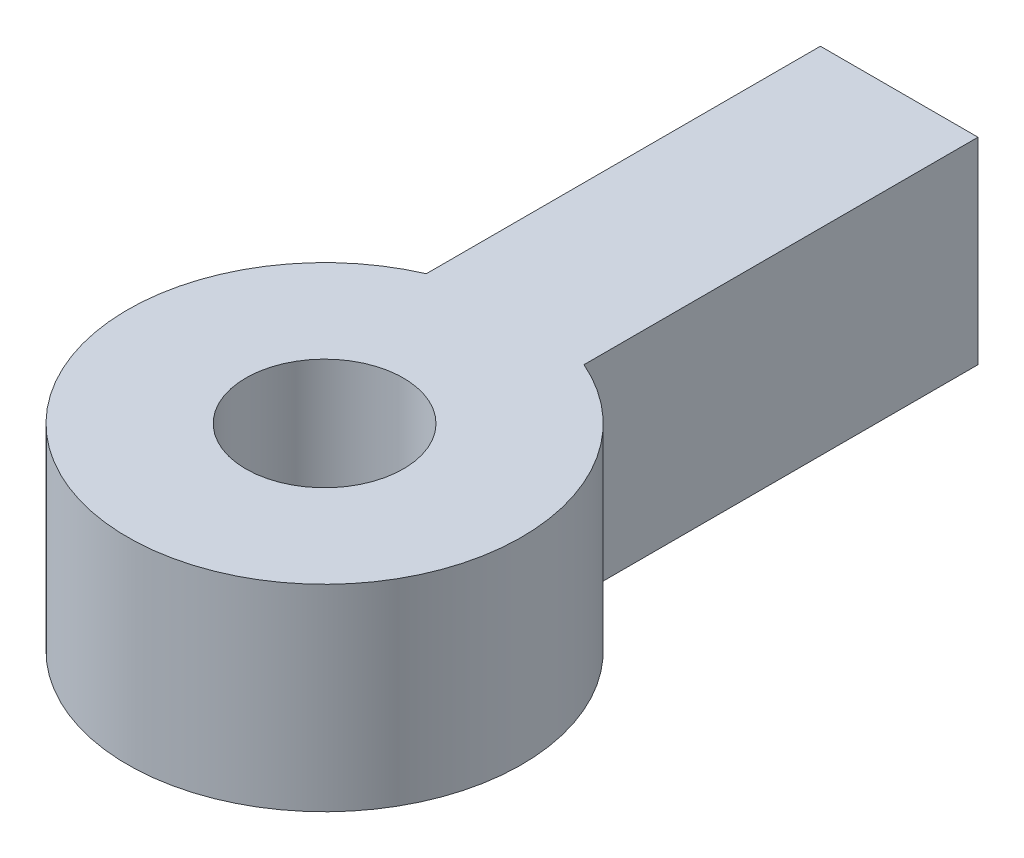
ISO-10303-21;
HEADER;
FILE_DESCRIPTION(('STEP AP214'),'2;1');
FILE_NAME('part.step','',(''),(''),'','','');
FILE_SCHEMA(('AUTOMOTIVE_DESIGN { 1 0 10303 214 1 1 1 1 }'));
ENDSEC;
DATA;
#1=APPLICATION_CONTEXT('core data for automotive mechanical design processes');
#2=APPLICATION_PROTOCOL_DEFINITION('international standard','automotive_design',2000,#1);
#3=PRODUCT_CONTEXT('',#1,'mechanical');
#4=PRODUCT('Part','Part','',(#3));
#5=PRODUCT_RELATED_PRODUCT_CATEGORY('part','',(#4));
#6=PRODUCT_DEFINITION_FORMATION('','',#4);
#7=PRODUCT_DEFINITION_CONTEXT('part definition',#1,'design');
#8=PRODUCT_DEFINITION('design','',#6,#7);
#9=PRODUCT_DEFINITION_SHAPE('','',#8);
#10=(LENGTH_UNIT() NAMED_UNIT(*) SI_UNIT(.MILLI.,.METRE.));
#11=(NAMED_UNIT(*) PLANE_ANGLE_UNIT() SI_UNIT($,.RADIAN.));
#12=(NAMED_UNIT(*) SI_UNIT($,.STERADIAN.) SOLID_ANGLE_UNIT());
#13=UNCERTAINTY_MEASURE_WITH_UNIT(LENGTH_MEASURE(1.E-05),#10,'distance_accuracy_value','');
#14=(GEOMETRIC_REPRESENTATION_CONTEXT(3) GLOBAL_UNCERTAINTY_ASSIGNED_CONTEXT((#13)) GLOBAL_UNIT_ASSIGNED_CONTEXT((#10,
#11,#12)) REPRESENTATION_CONTEXT('',''));
#15=CARTESIAN_POINT('',(0.,0.,0.));
#16=DIRECTION('',(0.,0.,1.));
#17=DIRECTION('',(1.,0.,0.));
#18=AXIS2_PLACEMENT_3D('',#15,#16,#17);
#19=CARTESIAN_POINT('',(0.,5.,0.));
#20=DIRECTION('',(0.,1.,0.));
#21=DIRECTION('',(0.,0.,1.));
#22=AXIS2_PLACEMENT_3D('',#19,#20,#21);
#23=PLANE('',#22);
#24=DIRECTION('',(0.,0.,1.));
#25=VECTOR('',#24,1.);
#26=CARTESIAN_POINT('',(-2.,5.,-14.5825756949558));
#27=LINE('',#26,#25);
#28=CARTESIAN_POINT('',(-2.,5.,-14.5825756949558));
#29=VERTEX_POINT('',#28);
#30=CARTESIAN_POINT('',(-2.,5.,-4.58257569495584));
#31=VERTEX_POINT('',#30);
#32=EDGE_CURVE('E85',#29,#31,#27,.T.);
#33=ORIENTED_EDGE('',*,*,#32,.T.);
#34=CARTESIAN_POINT('',(0.,5.,0.));
#35=DIRECTION('',(0.,1.,0.));
#36=DIRECTION('',(0.,0.,1.));
#37=AXIS2_PLACEMENT_3D('',#34,#35,#36);
#38=CIRCLE('',#37,5.);
#39=CARTESIAN_POINT('',(2.,5.,-4.58257569495584));
#40=VERTEX_POINT('',#39);
#41=EDGE_CURVE('E80',#31,#40,#38,.T.);
#42=ORIENTED_EDGE('',*,*,#41,.T.);
#43=DIRECTION('',(0.,0.,-1.));
#44=VECTOR('',#43,1.);
#45=CARTESIAN_POINT('',(2.,5.,-14.5825756949558));
#46=LINE('',#45,#44);
#47=CARTESIAN_POINT('',(2.,5.,-14.5825756949558));
#48=VERTEX_POINT('',#47);
#49=EDGE_CURVE('E83',#40,#48,#46,.T.);
#50=ORIENTED_EDGE('',*,*,#49,.T.);
#51=DIRECTION('',(-1.,0.,0.));
#52=VECTOR('',#51,1.);
#53=CARTESIAN_POINT('',(-2.,5.,-14.5825756949558));
#54=LINE('',#53,#52);
#55=EDGE_CURVE('E50',#48,#29,#54,.T.);
#56=ORIENTED_EDGE('',*,*,#55,.T.);
#57=EDGE_LOOP('',(#33,#42,#50,#56));
#58=FACE_BOUND('',#57,.T.);
#59=CARTESIAN_POINT('',(0.,5.,0.));
#60=DIRECTION('',(0.,1.,0.));
#61=DIRECTION('',(0.,0.,1.));
#62=AXIS2_PLACEMENT_3D('',#59,#60,#61);
#63=CIRCLE('',#62,2.);
#64=CARTESIAN_POINT('',(0.,5.,2.));
#65=VERTEX_POINT('',#64);
#66=EDGE_CURVE('E100',#65,#65,#63,.T.);
#67=ORIENTED_EDGE('',*,*,#66,.F.);
#68=EDGE_LOOP('',(#67));
#69=FACE_BOUND('',#68,.T.);
#70=ADVANCED_FACE('F33',(#58,#69),#23,.T.);
#71=CARTESIAN_POINT('',(0.,0.,0.));
#72=DIRECTION('',(0.,1.,0.));
#73=DIRECTION('',(0.,0.,1.));
#74=AXIS2_PLACEMENT_3D('',#71,#72,#73);
#75=PLANE('',#74);
#76=DIRECTION('',(0.,0.,1.));
#77=VECTOR('',#76,1.);
#78=CARTESIAN_POINT('',(-2.,0.,-14.5825756949558));
#79=LINE('',#78,#77);
#80=CARTESIAN_POINT('',(-2.,0.,-14.5825756949558));
#81=VERTEX_POINT('',#80);
#82=CARTESIAN_POINT('',(-2.,0.,-4.58257569495584));
#83=VERTEX_POINT('',#82);
#84=EDGE_CURVE('E97',#81,#83,#79,.T.);
#85=ORIENTED_EDGE('',*,*,#84,.F.);
#86=DIRECTION('',(-1.,0.,0.));
#87=VECTOR('',#86,1.);
#88=CARTESIAN_POINT('',(-2.,0.,-14.5825756949558));
#89=LINE('',#88,#87);
#90=CARTESIAN_POINT('',(2.,0.,-14.5825756949558));
#91=VERTEX_POINT('',#90);
#92=EDGE_CURVE('E73',#91,#81,#89,.T.);
#93=ORIENTED_EDGE('',*,*,#92,.F.);
#94=DIRECTION('',(0.,0.,-1.));
#95=VECTOR('',#94,1.);
#96=CARTESIAN_POINT('',(2.,0.,-14.5825756949558));
#97=LINE('',#96,#95);
#98=CARTESIAN_POINT('',(2.,0.,-4.58257569495584));
#99=VERTEX_POINT('',#98);
#100=EDGE_CURVE('E67',#99,#91,#97,.T.);
#101=ORIENTED_EDGE('',*,*,#100,.F.);
#102=CARTESIAN_POINT('',(0.,0.,0.));
#103=DIRECTION('',(0.,1.,0.));
#104=DIRECTION('',(0.,0.,1.));
#105=AXIS2_PLACEMENT_3D('',#102,#103,#104);
#106=CIRCLE('',#105,5.);
#107=EDGE_CURVE('E89',#83,#99,#106,.T.);
#108=ORIENTED_EDGE('',*,*,#107,.F.);
#109=EDGE_LOOP('',(#85,#93,#101,#108));
#110=FACE_BOUND('',#109,.T.);
#111=CARTESIAN_POINT('',(0.,0.,0.));
#112=DIRECTION('',(0.,1.,0.));
#113=DIRECTION('',(0.,0.,1.));
#114=AXIS2_PLACEMENT_3D('',#111,#112,#113);
#115=CIRCLE('',#114,2.);
#116=CARTESIAN_POINT('',(0.,0.,2.));
#117=VERTEX_POINT('',#116);
#118=EDGE_CURVE('E112',#117,#117,#115,.T.);
#119=ORIENTED_EDGE('',*,*,#118,.T.);
#120=EDGE_LOOP('',(#119));
#121=FACE_BOUND('',#120,.T.);
#122=ADVANCED_FACE('F108',(#110,#121),#75,.F.);
#123=CARTESIAN_POINT('',(-2.,5.,-14.5825756949558));
#124=DIRECTION('',(1.,0.,0.));
#125=DIRECTION('',(0.,0.,-1.));
#126=AXIS2_PLACEMENT_3D('',#123,#124,#125);
#127=PLANE('',#126);
#128=ORIENTED_EDGE('',*,*,#84,.T.);
#129=DIRECTION('',(0.,-1.,0.));
#130=VECTOR('',#129,1.);
#131=CARTESIAN_POINT('',(-2.,5.,-4.58257569495584));
#132=LINE('',#131,#130);
#133=EDGE_CURVE('E11',#31,#83,#132,.T.);
#134=ORIENTED_EDGE('',*,*,#133,.F.);
#135=ORIENTED_EDGE('',*,*,#32,.F.);
#136=DIRECTION('',(0.,-1.,0.));
#137=VECTOR('',#136,1.);
#138=CARTESIAN_POINT('',(-2.,5.,-14.5825756949558));
#139=LINE('',#138,#137);
#140=EDGE_CURVE('E93',#29,#81,#139,.T.);
#141=ORIENTED_EDGE('',*,*,#140,.T.);
#142=EDGE_LOOP('',(#128,#134,#135,#141));
#143=FACE_BOUND('',#142,.T.);
#144=ADVANCED_FACE('F35',(#143),#127,.F.);
#145=CARTESIAN_POINT('',(0.,5.,0.));
#146=DIRECTION('',(0.,-1.,0.));
#147=DIRECTION('',(0.,0.,-1.));
#148=AXIS2_PLACEMENT_3D('',#145,#146,#147);
#149=CYLINDRICAL_SURFACE('',#148,5.);
#150=ORIENTED_EDGE('',*,*,#107,.T.);
#151=DIRECTION('',(0.,-1.,0.));
#152=VECTOR('',#151,1.);
#153=CARTESIAN_POINT('',(2.,5.,-4.58257569495584));
#154=LINE('',#153,#152);
#155=EDGE_CURVE('E42',#40,#99,#154,.T.);
#156=ORIENTED_EDGE('',*,*,#155,.F.);
#157=ORIENTED_EDGE('',*,*,#41,.F.);
#158=ORIENTED_EDGE('',*,*,#133,.T.);
#159=EDGE_LOOP('',(#150,#156,#157,#158));
#160=FACE_BOUND('',#159,.T.);
#161=ADVANCED_FACE('F88',(#160),#149,.T.);
#162=CARTESIAN_POINT('',(2.,5.,-14.5825756949558));
#163=DIRECTION('',(-1.,0.,0.));
#164=DIRECTION('',(0.,0.,1.));
#165=AXIS2_PLACEMENT_3D('',#162,#163,#164);
#166=PLANE('',#165);
#167=ORIENTED_EDGE('',*,*,#100,.T.);
#168=DIRECTION('',(0.,-1.,0.));
#169=VECTOR('',#168,1.);
#170=CARTESIAN_POINT('',(2.,5.,-14.5825756949558));
#171=LINE('',#170,#169);
#172=EDGE_CURVE('E90',#48,#91,#171,.T.);
#173=ORIENTED_EDGE('',*,*,#172,.F.);
#174=ORIENTED_EDGE('',*,*,#49,.F.);
#175=ORIENTED_EDGE('',*,*,#155,.T.);
#176=EDGE_LOOP('',(#167,#173,#174,#175));
#177=FACE_BOUND('',#176,.T.);
#178=ADVANCED_FACE('F91',(#177),#166,.F.);
#179=CARTESIAN_POINT('',(-2.,5.,-14.5825756949558));
#180=DIRECTION('',(0.,0.,1.));
#181=DIRECTION('',(1.,0.,0.));
#182=AXIS2_PLACEMENT_3D('',#179,#180,#181);
#183=PLANE('',#182);
#184=ORIENTED_EDGE('',*,*,#92,.T.);
#185=ORIENTED_EDGE('',*,*,#140,.F.);
#186=ORIENTED_EDGE('',*,*,#55,.F.);
#187=ORIENTED_EDGE('',*,*,#172,.T.);
#188=EDGE_LOOP('',(#184,#185,#186,#187));
#189=FACE_BOUND('',#188,.T.);
#190=ADVANCED_FACE('F105',(#189),#183,.F.);
#191=CARTESIAN_POINT('',(0.,5.,0.));
#192=DIRECTION('',(0.,-1.,0.));
#193=DIRECTION('',(0.,0.,-1.));
#194=AXIS2_PLACEMENT_3D('',#191,#192,#193);
#195=CYLINDRICAL_SURFACE('',#194,2.);
#196=ORIENTED_EDGE('',*,*,#66,.T.);
#197=EDGE_LOOP('',(#196));
#198=FACE_BOUND('',#197,.T.);
#199=ORIENTED_EDGE('',*,*,#118,.F.);
#200=EDGE_LOOP('',(#199));
#201=FACE_BOUND('',#200,.T.);
#202=ADVANCED_FACE('F118',(#198,#201),#195,.F.);
#203=CLOSED_SHELL('',(#70,#122,#144,#161,#178,#190,#202));
#204=MANIFOLD_SOLID_BREP('B2',#203);
#205=ADVANCED_BREP_SHAPE_REPRESENTATION('',(#18,#204),#14);
#206=SHAPE_DEFINITION_REPRESENTATION(#9,#205);
ENDSEC;
END-ISO-10303-21;
